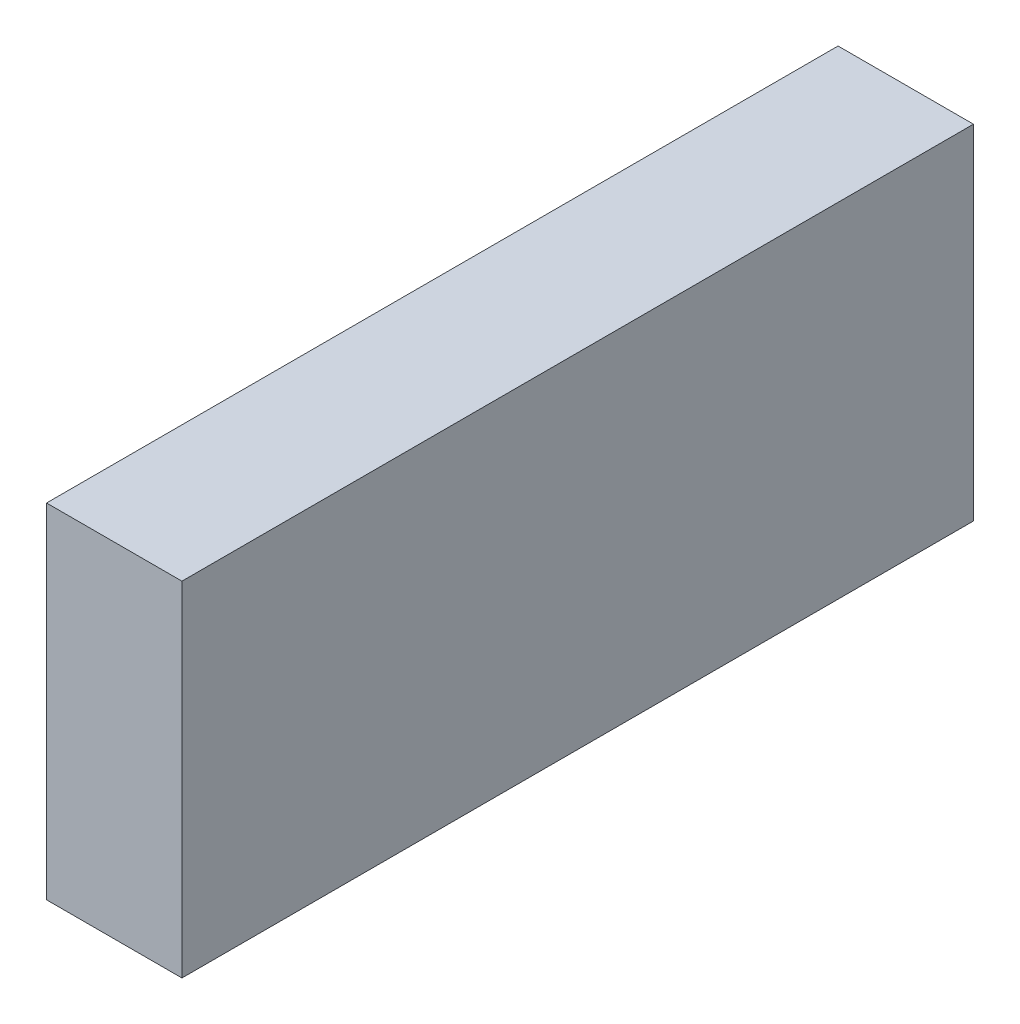
ISO-10303-21;
HEADER;
FILE_DESCRIPTION(('STEP AP214'),'2;1');
FILE_NAME('part.step','',(''),(''),'','','');
FILE_SCHEMA(('AUTOMOTIVE_DESIGN { 1 0 10303 214 1 1 1 1 }'));
ENDSEC;
DATA;
#1=APPLICATION_CONTEXT('core data for automotive mechanical design processes');
#2=APPLICATION_PROTOCOL_DEFINITION('international standard','automotive_design',2000,#1);
#3=PRODUCT_CONTEXT('',#1,'mechanical');
#4=PRODUCT('Part','Part','',(#3));
#5=PRODUCT_RELATED_PRODUCT_CATEGORY('part','',(#4));
#6=PRODUCT_DEFINITION_FORMATION('','',#4);
#7=PRODUCT_DEFINITION_CONTEXT('part definition',#1,'design');
#8=PRODUCT_DEFINITION('design','',#6,#7);
#9=PRODUCT_DEFINITION_SHAPE('','',#8);
#10=(LENGTH_UNIT() NAMED_UNIT(*) SI_UNIT(.MILLI.,.METRE.));
#11=(NAMED_UNIT(*) PLANE_ANGLE_UNIT() SI_UNIT($,.RADIAN.));
#12=(NAMED_UNIT(*) SI_UNIT($,.STERADIAN.) SOLID_ANGLE_UNIT());
#13=UNCERTAINTY_MEASURE_WITH_UNIT(LENGTH_MEASURE(1.E-05),#10,'distance_accuracy_value','');
#14=(GEOMETRIC_REPRESENTATION_CONTEXT(3) GLOBAL_UNCERTAINTY_ASSIGNED_CONTEXT((#13)) GLOBAL_UNIT_ASSIGNED_CONTEXT((#10,
#11,#12)) REPRESENTATION_CONTEXT('',''));
#15=CARTESIAN_POINT('',(0.,0.,0.));
#16=DIRECTION('',(0.,0.,1.));
#17=DIRECTION('',(1.,0.,0.));
#18=AXIS2_PLACEMENT_3D('',#15,#16,#17);
#19=CARTESIAN_POINT('',(-13.,-41.,38.));
#20=DIRECTION('',(0.,-1.,0.));
#21=DIRECTION('',(0.,0.,-1.));
#22=AXIS2_PLACEMENT_3D('',#19,#20,#21);
#23=PLANE('',#22);
#24=DIRECTION('',(0.,0.,-1.));
#25=VECTOR('',#24,1.);
#26=CARTESIAN_POINT('',(0.,-41.,38.));
#27=LINE('',#26,#25);
#28=CARTESIAN_POINT('',(0.,-41.,38.));
#29=VERTEX_POINT('',#28);
#30=CARTESIAN_POINT('',(0.,-41.,-38.));
#31=VERTEX_POINT('',#30);
#32=EDGE_CURVE('E104',#29,#31,#27,.T.);
#33=ORIENTED_EDGE('',*,*,#32,.F.);
#34=DIRECTION('',(1.,0.,0.));
#35=VECTOR('',#34,1.);
#36=CARTESIAN_POINT('',(-13.,-41.,38.));
#37=LINE('',#36,#35);
#38=CARTESIAN_POINT('',(-13.,-41.,38.));
#39=VERTEX_POINT('',#38);
#40=EDGE_CURVE('E11',#39,#29,#37,.T.);
#41=ORIENTED_EDGE('',*,*,#40,.F.);
#42=DIRECTION('',(0.,0.,-1.));
#43=VECTOR('',#42,1.);
#44=CARTESIAN_POINT('',(-13.,-41.,38.));
#45=LINE('',#44,#43);
#46=CARTESIAN_POINT('',(-13.,-41.,-38.));
#47=VERTEX_POINT('',#46);
#48=EDGE_CURVE('E97',#39,#47,#45,.T.);
#49=ORIENTED_EDGE('',*,*,#48,.T.);
#50=DIRECTION('',(1.,0.,0.));
#51=VECTOR('',#50,1.);
#52=CARTESIAN_POINT('',(-13.,-41.,-38.));
#53=LINE('',#52,#51);
#54=EDGE_CURVE('E42',#47,#31,#53,.T.);
#55=ORIENTED_EDGE('',*,*,#54,.T.);
#56=EDGE_LOOP('',(#33,#41,#49,#55));
#57=FACE_BOUND('',#56,.T.);
#58=ADVANCED_FACE('F41',(#57),#23,.T.);
#59=CARTESIAN_POINT('',(-13.,-8.,38.));
#60=DIRECTION('',(0.,0.,1.));
#61=DIRECTION('',(1.,0.,0.));
#62=AXIS2_PLACEMENT_3D('',#59,#60,#61);
#63=PLANE('',#62);
#64=DIRECTION('',(0.,-1.,0.));
#65=VECTOR('',#64,1.);
#66=CARTESIAN_POINT('',(0.,-8.,38.));
#67=LINE('',#66,#65);
#68=CARTESIAN_POINT('',(0.,-8.,38.));
#69=VERTEX_POINT('',#68);
#70=EDGE_CURVE('E101',#69,#29,#67,.T.);
#71=ORIENTED_EDGE('',*,*,#70,.F.);
#72=DIRECTION('',(1.,0.,0.));
#73=VECTOR('',#72,1.);
#74=CARTESIAN_POINT('',(-13.,-8.,38.));
#75=LINE('',#74,#73);
#76=CARTESIAN_POINT('',(-13.,-8.,38.));
#77=VERTEX_POINT('',#76);
#78=EDGE_CURVE('E49',#77,#69,#75,.T.);
#79=ORIENTED_EDGE('',*,*,#78,.F.);
#80=DIRECTION('',(0.,-1.,0.));
#81=VECTOR('',#80,1.);
#82=CARTESIAN_POINT('',(-13.,-8.,38.));
#83=LINE('',#82,#81);
#84=EDGE_CURVE('E96',#77,#39,#83,.T.);
#85=ORIENTED_EDGE('',*,*,#84,.T.);
#86=ORIENTED_EDGE('',*,*,#40,.T.);
#87=EDGE_LOOP('',(#71,#79,#85,#86));
#88=FACE_BOUND('',#87,.T.);
#89=ADVANCED_FACE('F113',(#88),#63,.T.);
#90=CARTESIAN_POINT('',(-13.,-8.,-38.));
#91=DIRECTION('',(0.,1.,0.));
#92=DIRECTION('',(0.,0.,1.));
#93=AXIS2_PLACEMENT_3D('',#90,#91,#92);
#94=PLANE('',#93);
#95=DIRECTION('',(0.,0.,1.));
#96=VECTOR('',#95,1.);
#97=CARTESIAN_POINT('',(0.,-8.,-38.));
#98=LINE('',#97,#96);
#99=CARTESIAN_POINT('',(0.,-8.,-38.));
#100=VERTEX_POINT('',#99);
#101=EDGE_CURVE('E93',#100,#69,#98,.T.);
#102=ORIENTED_EDGE('',*,*,#101,.F.);
#103=DIRECTION('',(1.,0.,0.));
#104=VECTOR('',#103,1.);
#105=CARTESIAN_POINT('',(-13.,-8.,-38.));
#106=LINE('',#105,#104);
#107=CARTESIAN_POINT('',(-13.,-8.,-38.));
#108=VERTEX_POINT('',#107);
#109=EDGE_CURVE('E88',#108,#100,#106,.T.);
#110=ORIENTED_EDGE('',*,*,#109,.F.);
#111=DIRECTION('',(0.,0.,1.));
#112=VECTOR('',#111,1.);
#113=CARTESIAN_POINT('',(-13.,-8.,-38.));
#114=LINE('',#113,#112);
#115=EDGE_CURVE('E90',#108,#77,#114,.T.);
#116=ORIENTED_EDGE('',*,*,#115,.T.);
#117=ORIENTED_EDGE('',*,*,#78,.T.);
#118=EDGE_LOOP('',(#102,#110,#116,#117));
#119=FACE_BOUND('',#118,.T.);
#120=ADVANCED_FACE('F86',(#119),#94,.T.);
#121=CARTESIAN_POINT('',(-13.,-41.,-38.));
#122=DIRECTION('',(0.,0.,-1.));
#123=DIRECTION('',(-1.,0.,0.));
#124=AXIS2_PLACEMENT_3D('',#121,#122,#123);
#125=PLANE('',#124);
#126=DIRECTION('',(0.,1.,0.));
#127=VECTOR('',#126,1.);
#128=CARTESIAN_POINT('',(0.,-41.,-38.));
#129=LINE('',#128,#127);
#130=EDGE_CURVE('E107',#31,#100,#129,.T.);
#131=ORIENTED_EDGE('',*,*,#130,.F.);
#132=ORIENTED_EDGE('',*,*,#54,.F.);
#133=DIRECTION('',(0.,1.,0.));
#134=VECTOR('',#133,1.);
#135=CARTESIAN_POINT('',(-13.,-41.,-38.));
#136=LINE('',#135,#134);
#137=EDGE_CURVE('E92',#47,#108,#136,.T.);
#138=ORIENTED_EDGE('',*,*,#137,.T.);
#139=ORIENTED_EDGE('',*,*,#109,.T.);
#140=EDGE_LOOP('',(#131,#132,#138,#139));
#141=FACE_BOUND('',#140,.T.);
#142=ADVANCED_FACE('F98',(#141),#125,.T.);
#143=CARTESIAN_POINT('',(-13.,0.,0.));
#144=DIRECTION('',(1.,0.,0.));
#145=DIRECTION('',(0.,0.,-1.));
#146=AXIS2_PLACEMENT_3D('',#143,#144,#145);
#147=PLANE('',#146);
#148=ORIENTED_EDGE('',*,*,#48,.F.);
#149=ORIENTED_EDGE('',*,*,#84,.F.);
#150=ORIENTED_EDGE('',*,*,#115,.F.);
#151=ORIENTED_EDGE('',*,*,#137,.F.);
#152=EDGE_LOOP('',(#148,#149,#150,#151));
#153=FACE_BOUND('',#152,.T.);
#154=ADVANCED_FACE('F94',(#153),#147,.F.);
#155=CARTESIAN_POINT('',(0.,0.,0.));
#156=DIRECTION('',(1.,0.,0.));
#157=DIRECTION('',(0.,0.,-1.));
#158=AXIS2_PLACEMENT_3D('',#155,#156,#157);
#159=PLANE('',#158);
#160=ORIENTED_EDGE('',*,*,#32,.T.);
#161=ORIENTED_EDGE('',*,*,#130,.T.);
#162=ORIENTED_EDGE('',*,*,#101,.T.);
#163=ORIENTED_EDGE('',*,*,#70,.T.);
#164=EDGE_LOOP('',(#160,#161,#162,#163));
#165=FACE_BOUND('',#164,.T.);
#166=ADVANCED_FACE('F111',(#165),#159,.T.);
#167=CLOSED_SHELL('',(#58,#89,#120,#142,#154,#166));
#168=MANIFOLD_SOLID_BREP('B2',#167);
#169=ADVANCED_BREP_SHAPE_REPRESENTATION('',(#18,#168),#14);
#170=SHAPE_DEFINITION_REPRESENTATION(#9,#169);
ENDSEC;
END-ISO-10303-21;
